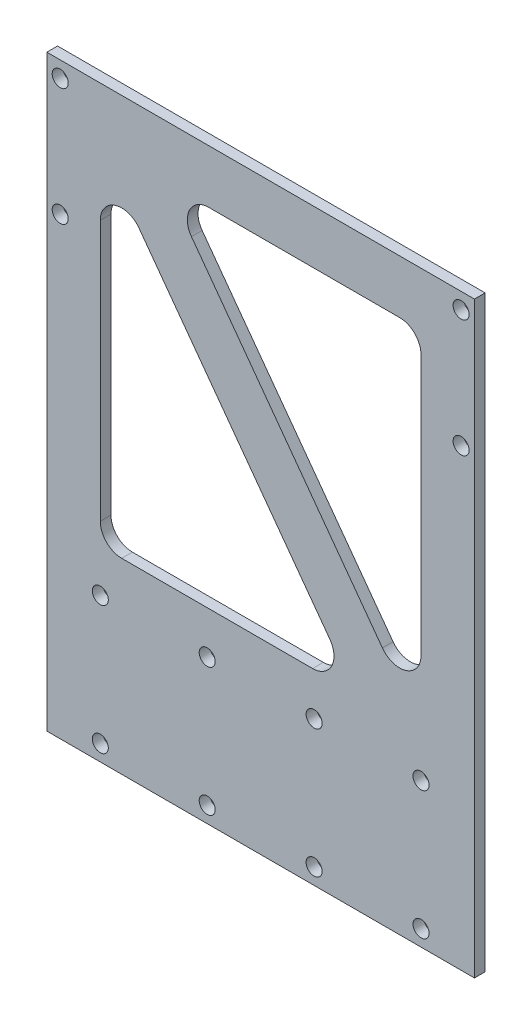
ISO-10303-21;
HEADER;
FILE_DESCRIPTION(('STEP AP214'),'2;1');
FILE_NAME('part.step','',(''),(''),'','','');
FILE_SCHEMA(('AUTOMOTIVE_DESIGN { 1 0 10303 214 1 1 1 1 }'));
ENDSEC;
DATA;
#1=APPLICATION_CONTEXT('core data for automotive mechanical design processes');
#2=APPLICATION_PROTOCOL_DEFINITION('international standard','automotive_design',2000,#1);
#3=PRODUCT_CONTEXT('',#1,'mechanical');
#4=PRODUCT('Part','Part','',(#3));
#5=PRODUCT_RELATED_PRODUCT_CATEGORY('part','',(#4));
#6=PRODUCT_DEFINITION_FORMATION('','',#4);
#7=PRODUCT_DEFINITION_CONTEXT('part definition',#1,'design');
#8=PRODUCT_DEFINITION('design','',#6,#7);
#9=PRODUCT_DEFINITION_SHAPE('','',#8);
#10=(LENGTH_UNIT() NAMED_UNIT(*) SI_UNIT(.MILLI.,.METRE.));
#11=(NAMED_UNIT(*) PLANE_ANGLE_UNIT() SI_UNIT($,.RADIAN.));
#12=(NAMED_UNIT(*) SI_UNIT($,.STERADIAN.) SOLID_ANGLE_UNIT());
#13=UNCERTAINTY_MEASURE_WITH_UNIT(LENGTH_MEASURE(1.E-05),#10,'distance_accuracy_value','');
#14=(GEOMETRIC_REPRESENTATION_CONTEXT(3) GLOBAL_UNCERTAINTY_ASSIGNED_CONTEXT((#13)) GLOBAL_UNIT_ASSIGNED_CONTEXT((#10,
#11,#12)) REPRESENTATION_CONTEXT('',''));
#15=CARTESIAN_POINT('',(0.,0.,0.));
#16=DIRECTION('',(0.,0.,1.));
#17=DIRECTION('',(1.,0.,0.));
#18=AXIS2_PLACEMENT_3D('',#15,#16,#17);
#19=CARTESIAN_POINT('',(0.,0.,2.));
#20=DIRECTION('',(0.,0.,-1.));
#21=DIRECTION('',(-1.,0.,0.));
#22=AXIS2_PLACEMENT_3D('',#19,#20,#21);
#23=PLANE('',#22);
#24=DIRECTION('',(0.590865015894451,-0.806770433885656,0.));
#25=VECTOR('',#24,1.);
#26=CARTESIAN_POINT('',(22.3950997458309,100.,2.));
#27=LINE('',#26,#25);
#28=CARTESIAN_POINT('',(27.0555902319542,93.6365399364222,2.));
#29=VERTEX_POINT('',#28);
#30=CARTESIAN_POINT('',(62.7729182644574,44.867898268921,2.));
#31=VERTEX_POINT('',#30);
#32=EDGE_CURVE('E540',#29,#31,#27,.T.);
#33=ORIENTED_EDGE('',*,*,#32,.F.);
#34=CARTESIAN_POINT('',(30.2826719674968,96.,2.));
#35=DIRECTION('',(0.,0.,-1.));
#36=DIRECTION('',(-1.,0.,0.));
#37=AXIS2_PLACEMENT_3D('',#34,#35,#36);
#38=CIRCLE('',#37,4.);
#39=CARTESIAN_POINT('',(30.2826719674968,100.,2.));
#40=VERTEX_POINT('',#39);
#41=EDGE_CURVE('E262',#29,#40,#38,.T.);
#42=ORIENTED_EDGE('',*,*,#41,.T.);
#43=DIRECTION('',(-1.,0.,0.));
#44=VECTOR('',#43,1.);
#45=CARTESIAN_POINT('',(70.,100.,2.));
#46=LINE('',#45,#44);
#47=CARTESIAN_POINT('',(66.,100.,2.));
#48=VERTEX_POINT('',#47);
#49=EDGE_CURVE('E296',#48,#40,#46,.T.);
#50=ORIENTED_EDGE('',*,*,#49,.F.);
#51=CARTESIAN_POINT('',(66.,96.,2.));
#52=DIRECTION('',(0.,0.,-1.));
#53=DIRECTION('',(-1.,0.,0.));
#54=AXIS2_PLACEMENT_3D('',#51,#52,#53);
#55=CIRCLE('',#54,4.);
#56=CARTESIAN_POINT('',(70.,96.,2.));
#57=VERTEX_POINT('',#56);
#58=EDGE_CURVE('E269',#48,#57,#55,.T.);
#59=ORIENTED_EDGE('',*,*,#58,.T.);
#60=DIRECTION('',(0.,1.,0.));
#61=VECTOR('',#60,1.);
#62=CARTESIAN_POINT('',(70.,35.,2.));
#63=LINE('',#62,#61);
#64=CARTESIAN_POINT('',(70.,47.2313583324988,2.));
#65=VERTEX_POINT('',#64);
#66=EDGE_CURVE('E551',#65,#57,#63,.T.);
#67=ORIENTED_EDGE('',*,*,#66,.F.);
#68=CARTESIAN_POINT('',(66.,47.2313583324988,2.));
#69=DIRECTION('',(0.,0.,-1.));
#70=DIRECTION('',(-1.,0.,0.));
#71=AXIS2_PLACEMENT_3D('',#68,#69,#70);
#72=CIRCLE('',#71,4.);
#73=EDGE_CURVE('E256',#65,#31,#72,.T.);
#74=ORIENTED_EDGE('',*,*,#73,.T.);
#75=EDGE_LOOP('',(#33,#42,#50,#59,#67,#74));
#76=FACE_BOUND('',#75,.T.);
#77=DIRECTION('',(0.,-1.,0.));
#78=VECTOR('',#77,1.);
#79=CARTESIAN_POINT('',(10.,100.,2.));
#80=LINE('',#79,#78);
#81=CARTESIAN_POINT('',(10.,87.7686416675012,2.));
#82=VERTEX_POINT('',#81);
#83=CARTESIAN_POINT('',(10.,39.,2.));
#84=VERTEX_POINT('',#83);
#85=EDGE_CURVE('E295',#82,#84,#80,.T.);
#86=ORIENTED_EDGE('',*,*,#85,.F.);
#87=CARTESIAN_POINT('',(14.,87.7686416675012,2.));
#88=DIRECTION('',(0.,0.,-1.));
#89=DIRECTION('',(-1.,0.,0.));
#90=AXIS2_PLACEMENT_3D('',#87,#88,#89);
#91=CIRCLE('',#90,4.);
#92=CARTESIAN_POINT('',(17.2270817355426,90.132101731079,2.));
#93=VERTEX_POINT('',#92);
#94=EDGE_CURVE('E53',#82,#93,#91,.T.);
#95=ORIENTED_EDGE('',*,*,#94,.T.);
#96=DIRECTION('',(-0.590865015894452,0.806770433885656,0.));
#97=VECTOR('',#96,1.);
#98=CARTESIAN_POINT('',(57.6049002541691,35.,2.));
#99=LINE('',#98,#97);
#100=CARTESIAN_POINT('',(52.9444097680458,41.3634600635778,2.));
#101=VERTEX_POINT('',#100);
#102=EDGE_CURVE('E292',#101,#93,#99,.T.);
#103=ORIENTED_EDGE('',*,*,#102,.F.);
#104=CARTESIAN_POINT('',(49.7173280325032,39.,2.));
#105=DIRECTION('',(0.,0.,-1.));
#106=DIRECTION('',(-1.,0.,0.));
#107=AXIS2_PLACEMENT_3D('',#104,#105,#106);
#108=CIRCLE('',#107,4.);
#109=CARTESIAN_POINT('',(49.7173280325032,35.,2.));
#110=VERTEX_POINT('',#109);
#111=EDGE_CURVE('E277',#101,#110,#108,.T.);
#112=ORIENTED_EDGE('',*,*,#111,.T.);
#113=DIRECTION('',(1.,0.,0.));
#114=VECTOR('',#113,1.);
#115=CARTESIAN_POINT('',(10.,35.,2.));
#116=LINE('',#115,#114);
#117=CARTESIAN_POINT('',(14.,35.,2.));
#118=VERTEX_POINT('',#117);
#119=EDGE_CURVE('E318',#118,#110,#116,.T.);
#120=ORIENTED_EDGE('',*,*,#119,.F.);
#121=CARTESIAN_POINT('',(14.,39.,2.));
#122=DIRECTION('',(0.,0.,-1.));
#123=DIRECTION('',(-1.,0.,0.));
#124=AXIS2_PLACEMENT_3D('',#121,#122,#123);
#125=CIRCLE('',#124,4.);
#126=EDGE_CURVE('E63',#118,#84,#125,.T.);
#127=ORIENTED_EDGE('',*,*,#126,.T.);
#128=EDGE_LOOP('',(#86,#95,#103,#112,#120,#127));
#129=FACE_BOUND('',#128,.T.);
#130=DIRECTION('',(0.,-1.,0.));
#131=VECTOR('',#130,1.);
#132=CARTESIAN_POINT('',(0.,0.,2.));
#133=LINE('',#132,#131);
#134=CARTESIAN_POINT('',(0.,110.,2.));
#135=VERTEX_POINT('',#134);
#136=CARTESIAN_POINT('',(0.,0.,2.));
#137=VERTEX_POINT('',#136);
#138=EDGE_CURVE('E173',#135,#137,#133,.T.);
#139=ORIENTED_EDGE('',*,*,#138,.T.);
#140=DIRECTION('',(1.,0.,0.));
#141=VECTOR('',#140,1.);
#142=CARTESIAN_POINT('',(0.,0.,2.));
#143=LINE('',#142,#141);
#144=CARTESIAN_POINT('',(80.,0.,2.));
#145=VERTEX_POINT('',#144);
#146=EDGE_CURVE('E157',#137,#145,#143,.T.);
#147=ORIENTED_EDGE('',*,*,#146,.T.);
#148=DIRECTION('',(0.,1.,0.));
#149=VECTOR('',#148,1.);
#150=CARTESIAN_POINT('',(80.,0.,2.));
#151=LINE('',#150,#149);
#152=CARTESIAN_POINT('',(80.,110.,2.));
#153=VERTEX_POINT('',#152);
#154=EDGE_CURVE('E168',#145,#153,#151,.T.);
#155=ORIENTED_EDGE('',*,*,#154,.T.);
#156=DIRECTION('',(-1.,0.,0.));
#157=VECTOR('',#156,1.);
#158=CARTESIAN_POINT('',(0.,110.,2.));
#159=LINE('',#158,#157);
#160=EDGE_CURVE('E176',#153,#135,#159,.T.);
#161=ORIENTED_EDGE('',*,*,#160,.T.);
#162=EDGE_LOOP('',(#139,#147,#155,#161));
#163=FACE_BOUND('',#162,.T.);
#164=CARTESIAN_POINT('',(9.99999999999999,3.,2.));
#165=DIRECTION('',(0.,0.,1.));
#166=DIRECTION('',(1.,0.,0.));
#167=AXIS2_PLACEMENT_3D('',#164,#165,#166);
#168=CIRCLE('',#167,1.5);
#169=CARTESIAN_POINT('',(11.5,3.,2.));
#170=VERTEX_POINT('',#169);
#171=EDGE_CURVE('E415',#170,#170,#168,.T.);
#172=ORIENTED_EDGE('',*,*,#171,.F.);
#173=EDGE_LOOP('',(#172));
#174=FACE_BOUND('',#173,.T.);
#175=CARTESIAN_POINT('',(30.,3.,2.));
#176=DIRECTION('',(0.,0.,1.));
#177=DIRECTION('',(1.,0.,0.));
#178=AXIS2_PLACEMENT_3D('',#175,#176,#177);
#179=CIRCLE('',#178,1.5);
#180=CARTESIAN_POINT('',(31.5,3.,2.));
#181=VERTEX_POINT('',#180);
#182=EDGE_CURVE('E410',#181,#181,#179,.T.);
#183=ORIENTED_EDGE('',*,*,#182,.F.);
#184=EDGE_LOOP('',(#183));
#185=FACE_BOUND('',#184,.T.);
#186=CARTESIAN_POINT('',(50.,3.,2.));
#187=DIRECTION('',(0.,0.,1.));
#188=DIRECTION('',(-1.,0.,0.));
#189=AXIS2_PLACEMENT_3D('',#186,#187,#188);
#190=CIRCLE('',#189,1.5);
#191=CARTESIAN_POINT('',(48.5,3.,2.));
#192=VERTEX_POINT('',#191);
#193=EDGE_CURVE('E398',#192,#192,#190,.T.);
#194=ORIENTED_EDGE('',*,*,#193,.F.);
#195=EDGE_LOOP('',(#194));
#196=FACE_BOUND('',#195,.T.);
#197=CARTESIAN_POINT('',(70.,3.,2.));
#198=DIRECTION('',(0.,0.,1.));
#199=DIRECTION('',(-1.,0.,0.));
#200=AXIS2_PLACEMENT_3D('',#197,#198,#199);
#201=CIRCLE('',#200,1.5);
#202=CARTESIAN_POINT('',(68.5,3.,2.));
#203=VERTEX_POINT('',#202);
#204=EDGE_CURVE('E393',#203,#203,#201,.T.);
#205=ORIENTED_EDGE('',*,*,#204,.F.);
#206=EDGE_LOOP('',(#205));
#207=FACE_BOUND('',#206,.T.);
#208=CARTESIAN_POINT('',(2.5,107.,2.));
#209=DIRECTION('',(0.,0.,1.));
#210=DIRECTION('',(1.,0.,0.));
#211=AXIS2_PLACEMENT_3D('',#208,#209,#210);
#212=CIRCLE('',#211,1.5);
#213=CARTESIAN_POINT('',(4.,107.,2.));
#214=VERTEX_POINT('',#213);
#215=EDGE_CURVE('E382',#214,#214,#212,.T.);
#216=ORIENTED_EDGE('',*,*,#215,.F.);
#217=EDGE_LOOP('',(#216));
#218=FACE_BOUND('',#217,.T.);
#219=CARTESIAN_POINT('',(2.5,85.,2.));
#220=DIRECTION('',(0.,0.,1.));
#221=DIRECTION('',(1.,0.,0.));
#222=AXIS2_PLACEMENT_3D('',#219,#220,#221);
#223=CIRCLE('',#222,1.5);
#224=CARTESIAN_POINT('',(4.,85.,2.));
#225=VERTEX_POINT('',#224);
#226=EDGE_CURVE('E376',#225,#225,#223,.T.);
#227=ORIENTED_EDGE('',*,*,#226,.F.);
#228=EDGE_LOOP('',(#227));
#229=FACE_BOUND('',#228,.T.);
#230=CARTESIAN_POINT('',(77.5,85.,2.));
#231=DIRECTION('',(0.,0.,1.));
#232=DIRECTION('',(-1.,0.,0.));
#233=AXIS2_PLACEMENT_3D('',#230,#231,#232);
#234=CIRCLE('',#233,1.5);
#235=CARTESIAN_POINT('',(76.,85.,2.));
#236=VERTEX_POINT('',#235);
#237=EDGE_CURVE('E366',#236,#236,#234,.T.);
#238=ORIENTED_EDGE('',*,*,#237,.F.);
#239=EDGE_LOOP('',(#238));
#240=FACE_BOUND('',#239,.T.);
#241=CARTESIAN_POINT('',(77.5,107.,2.));
#242=DIRECTION('',(0.,0.,1.));
#243=DIRECTION('',(-1.,0.,0.));
#244=AXIS2_PLACEMENT_3D('',#241,#242,#243);
#245=CIRCLE('',#244,1.5);
#246=CARTESIAN_POINT('',(76.,107.,2.));
#247=VERTEX_POINT('',#246);
#248=EDGE_CURVE('E360',#247,#247,#245,.T.);
#249=ORIENTED_EDGE('',*,*,#248,.F.);
#250=EDGE_LOOP('',(#249));
#251=FACE_BOUND('',#250,.T.);
#252=CARTESIAN_POINT('',(9.99999999999991,27.,2.));
#253=DIRECTION('',(0.,0.,1.));
#254=DIRECTION('',(1.,0.,0.));
#255=AXIS2_PLACEMENT_3D('',#252,#253,#254);
#256=CIRCLE('',#255,1.5);
#257=CARTESIAN_POINT('',(11.4999999999999,27.,2.));
#258=VERTEX_POINT('',#257);
#259=EDGE_CURVE('E355',#258,#258,#256,.T.);
#260=ORIENTED_EDGE('',*,*,#259,.F.);
#261=EDGE_LOOP('',(#260));
#262=FACE_BOUND('',#261,.T.);
#263=CARTESIAN_POINT('',(29.9999999999999,27.,2.));
#264=DIRECTION('',(0.,0.,1.));
#265=DIRECTION('',(1.,0.,0.));
#266=AXIS2_PLACEMENT_3D('',#263,#264,#265);
#267=CIRCLE('',#266,1.5);
#268=CARTESIAN_POINT('',(31.4999999999999,27.,2.));
#269=VERTEX_POINT('',#268);
#270=EDGE_CURVE('E343',#269,#269,#267,.T.);
#271=ORIENTED_EDGE('',*,*,#270,.F.);
#272=EDGE_LOOP('',(#271));
#273=FACE_BOUND('',#272,.T.);
#274=CARTESIAN_POINT('',(49.9999999999999,27.,2.));
#275=DIRECTION('',(0.,0.,1.));
#276=DIRECTION('',(-1.,0.,0.));
#277=AXIS2_PLACEMENT_3D('',#274,#275,#276);
#278=CIRCLE('',#277,1.5);
#279=CARTESIAN_POINT('',(48.4999999999999,27.,2.));
#280=VERTEX_POINT('',#279);
#281=EDGE_CURVE('E338',#280,#280,#278,.T.);
#282=ORIENTED_EDGE('',*,*,#281,.F.);
#283=EDGE_LOOP('',(#282));
#284=FACE_BOUND('',#283,.T.);
#285=CARTESIAN_POINT('',(69.9999999999999,27.,2.));
#286=DIRECTION('',(0.,0.,1.));
#287=DIRECTION('',(-1.,0.,0.));
#288=AXIS2_PLACEMENT_3D('',#285,#286,#287);
#289=CIRCLE('',#288,1.5);
#290=CARTESIAN_POINT('',(68.4999999999999,27.,2.));
#291=VERTEX_POINT('',#290);
#292=EDGE_CURVE('E327',#291,#291,#289,.T.);
#293=ORIENTED_EDGE('',*,*,#292,.F.);
#294=EDGE_LOOP('',(#293));
#295=FACE_BOUND('',#294,.T.);
#296=ADVANCED_FACE('F44',(#76,#129,#163,#174,#185,#196,#207,#218,#229,#240,#251,#262,#273,#284,
#295),#23,.F.);
#297=CARTESIAN_POINT('',(0.,0.,0.));
#298=DIRECTION('',(0.,0.,-1.));
#299=DIRECTION('',(-1.,0.,0.));
#300=AXIS2_PLACEMENT_3D('',#297,#298,#299);
#301=PLANE('',#300);
#302=DIRECTION('',(1.,0.,0.));
#303=VECTOR('',#302,1.);
#304=CARTESIAN_POINT('',(0.,100.,0.));
#305=LINE('',#304,#303);
#306=CARTESIAN_POINT('',(30.2826719674968,100.,0.));
#307=VERTEX_POINT('',#306);
#308=CARTESIAN_POINT('',(66.,100.,0.));
#309=VERTEX_POINT('',#308);
#310=EDGE_CURVE('E212',#307,#309,#305,.T.);
#311=ORIENTED_EDGE('',*,*,#310,.F.);
#312=CARTESIAN_POINT('',(30.2826719674968,96.,0.));
#313=DIRECTION('',(0.,0.,-1.));
#314=DIRECTION('',(-1.,0.,0.));
#315=AXIS2_PLACEMENT_3D('',#312,#313,#314);
#316=CIRCLE('',#315,4.);
#317=CARTESIAN_POINT('',(27.0555902319542,93.6365399364222,0.));
#318=VERTEX_POINT('',#317);
#319=EDGE_CURVE('E270',#307,#318,#316,.F.);
#320=ORIENTED_EDGE('',*,*,#319,.T.);
#321=DIRECTION('',(-0.590865015894452,0.806770433885656,0.));
#322=VECTOR('',#321,1.);
#323=CARTESIAN_POINT('',(62.2457321928792,45.5877211121498,0.));
#324=LINE('',#323,#322);
#325=CARTESIAN_POINT('',(62.7729182644574,44.867898268921,0.));
#326=VERTEX_POINT('',#325);
#327=EDGE_CURVE('E206',#326,#318,#324,.T.);
#328=ORIENTED_EDGE('',*,*,#327,.F.);
#329=CARTESIAN_POINT('',(66.,47.2313583324988,0.));
#330=DIRECTION('',(0.,0.,-1.));
#331=DIRECTION('',(-1.,0.,0.));
#332=AXIS2_PLACEMENT_3D('',#329,#330,#331);
#333=CIRCLE('',#332,4.);
#334=CARTESIAN_POINT('',(70.,47.2313583324988,0.));
#335=VERTEX_POINT('',#334);
#336=EDGE_CURVE('E261',#326,#335,#333,.F.);
#337=ORIENTED_EDGE('',*,*,#336,.T.);
#338=DIRECTION('',(0.,-1.,0.));
#339=VECTOR('',#338,1.);
#340=CARTESIAN_POINT('',(70.,0.,0.));
#341=LINE('',#340,#339);
#342=CARTESIAN_POINT('',(70.,96.,0.));
#343=VERTEX_POINT('',#342);
#344=EDGE_CURVE('E209',#343,#335,#341,.T.);
#345=ORIENTED_EDGE('',*,*,#344,.F.);
#346=CARTESIAN_POINT('',(66.,96.,0.));
#347=DIRECTION('',(0.,0.,-1.));
#348=DIRECTION('',(-1.,0.,0.));
#349=AXIS2_PLACEMENT_3D('',#346,#347,#348);
#350=CIRCLE('',#349,4.);
#351=EDGE_CURVE('E272',#343,#309,#350,.F.);
#352=ORIENTED_EDGE('',*,*,#351,.T.);
#353=EDGE_LOOP('',(#311,#320,#328,#337,#345,#352));
#354=FACE_BOUND('',#353,.T.);
#355=DIRECTION('',(0.590865015894452,-0.806770433885656,0.));
#356=VECTOR('',#355,1.);
#357=CARTESIAN_POINT('',(54.1780278540227,39.6790709532052,0.));
#358=LINE('',#357,#356);
#359=CARTESIAN_POINT('',(17.2270817355426,90.132101731079,0.));
#360=VERTEX_POINT('',#359);
#361=CARTESIAN_POINT('',(52.9444097680458,41.3634600635778,0.));
#362=VERTEX_POINT('',#361);
#363=EDGE_CURVE('E205',#360,#362,#358,.T.);
#364=ORIENTED_EDGE('',*,*,#363,.F.);
#365=CARTESIAN_POINT('',(14.,87.7686416675012,0.));
#366=DIRECTION('',(0.,0.,-1.));
#367=DIRECTION('',(-1.,0.,0.));
#368=AXIS2_PLACEMENT_3D('',#365,#366,#367);
#369=CIRCLE('',#368,4.);
#370=CARTESIAN_POINT('',(10.,87.7686416675012,0.));
#371=VERTEX_POINT('',#370);
#372=EDGE_CURVE('E11',#360,#371,#369,.F.);
#373=ORIENTED_EDGE('',*,*,#372,.T.);
#374=DIRECTION('',(0.,1.,0.));
#375=VECTOR('',#374,1.);
#376=CARTESIAN_POINT('',(10.,0.,0.));
#377=LINE('',#376,#375);
#378=CARTESIAN_POINT('',(10.,39.,0.));
#379=VERTEX_POINT('',#378);
#380=EDGE_CURVE('E190',#379,#371,#377,.T.);
#381=ORIENTED_EDGE('',*,*,#380,.F.);
#382=CARTESIAN_POINT('',(14.,39.,0.));
#383=DIRECTION('',(0.,0.,-1.));
#384=DIRECTION('',(-1.,0.,0.));
#385=AXIS2_PLACEMENT_3D('',#382,#383,#384);
#386=CIRCLE('',#385,4.);
#387=CARTESIAN_POINT('',(14.,35.,0.));
#388=VERTEX_POINT('',#387);
#389=EDGE_CURVE('E284',#379,#388,#386,.F.);
#390=ORIENTED_EDGE('',*,*,#389,.T.);
#391=DIRECTION('',(-1.,0.,0.));
#392=VECTOR('',#391,1.);
#393=CARTESIAN_POINT('',(0.,35.,0.));
#394=LINE('',#393,#392);
#395=CARTESIAN_POINT('',(49.7173280325032,35.,0.));
#396=VERTEX_POINT('',#395);
#397=EDGE_CURVE('E194',#396,#388,#394,.T.);
#398=ORIENTED_EDGE('',*,*,#397,.F.);
#399=CARTESIAN_POINT('',(49.7173280325032,39.,0.));
#400=DIRECTION('',(0.,0.,-1.));
#401=DIRECTION('',(-1.,0.,0.));
#402=AXIS2_PLACEMENT_3D('',#399,#400,#401);
#403=CIRCLE('',#402,4.);
#404=EDGE_CURVE('E276',#396,#362,#403,.F.);
#405=ORIENTED_EDGE('',*,*,#404,.T.);
#406=EDGE_LOOP('',(#364,#373,#381,#390,#398,#405));
#407=FACE_BOUND('',#406,.T.);
#408=CARTESIAN_POINT('',(49.9999999999999,27.,0.));
#409=DIRECTION('',(0.,0.,1.));
#410=DIRECTION('',(-1.,0.,0.));
#411=AXIS2_PLACEMENT_3D('',#408,#409,#410);
#412=CIRCLE('',#411,1.5);
#413=CARTESIAN_POINT('',(48.4999999999999,27.,0.));
#414=VERTEX_POINT('',#413);
#415=EDGE_CURVE('E331',#414,#414,#412,.T.);
#416=ORIENTED_EDGE('',*,*,#415,.T.);
#417=EDGE_LOOP('',(#416));
#418=FACE_BOUND('',#417,.T.);
#419=CARTESIAN_POINT('',(9.99999999999991,27.,0.));
#420=DIRECTION('',(0.,0.,1.));
#421=DIRECTION('',(1.,0.,0.));
#422=AXIS2_PLACEMENT_3D('',#419,#420,#421);
#423=CIRCLE('',#422,1.5);
#424=CARTESIAN_POINT('',(11.4999999999999,27.,0.));
#425=VERTEX_POINT('',#424);
#426=EDGE_CURVE('E346',#425,#425,#423,.T.);
#427=ORIENTED_EDGE('',*,*,#426,.T.);
#428=EDGE_LOOP('',(#427));
#429=FACE_BOUND('',#428,.T.);
#430=CARTESIAN_POINT('',(77.5,85.,0.));
#431=DIRECTION('',(0.,0.,1.));
#432=DIRECTION('',(-1.,0.,0.));
#433=AXIS2_PLACEMENT_3D('',#430,#431,#432);
#434=CIRCLE('',#433,1.5);
#435=CARTESIAN_POINT('',(76.,85.,0.));
#436=VERTEX_POINT('',#435);
#437=EDGE_CURVE('E365',#436,#436,#434,.T.);
#438=ORIENTED_EDGE('',*,*,#437,.T.);
#439=EDGE_LOOP('',(#438));
#440=FACE_BOUND('',#439,.T.);
#441=CARTESIAN_POINT('',(2.5,107.,0.));
#442=DIRECTION('',(0.,0.,1.));
#443=DIRECTION('',(1.,0.,0.));
#444=AXIS2_PLACEMENT_3D('',#441,#442,#443);
#445=CIRCLE('',#444,1.5);
#446=CARTESIAN_POINT('',(4.,107.,0.));
#447=VERTEX_POINT('',#446);
#448=EDGE_CURVE('E377',#447,#447,#445,.T.);
#449=ORIENTED_EDGE('',*,*,#448,.T.);
#450=EDGE_LOOP('',(#449));
#451=FACE_BOUND('',#450,.T.);
#452=CARTESIAN_POINT('',(50.,3.,0.));
#453=DIRECTION('',(0.,0.,1.));
#454=DIRECTION('',(-1.,0.,0.));
#455=AXIS2_PLACEMENT_3D('',#452,#453,#454);
#456=CIRCLE('',#455,1.5);
#457=CARTESIAN_POINT('',(48.5,3.,0.));
#458=VERTEX_POINT('',#457);
#459=EDGE_CURVE('E392',#458,#458,#456,.T.);
#460=ORIENTED_EDGE('',*,*,#459,.T.);
#461=EDGE_LOOP('',(#460));
#462=FACE_BOUND('',#461,.T.);
#463=CARTESIAN_POINT('',(9.99999999999999,3.,0.));
#464=DIRECTION('',(0.,0.,1.));
#465=DIRECTION('',(1.,0.,0.));
#466=AXIS2_PLACEMENT_3D('',#463,#464,#465);
#467=CIRCLE('',#466,1.5);
#468=CARTESIAN_POINT('',(11.5,3.,0.));
#469=VERTEX_POINT('',#468);
#470=EDGE_CURVE('E411',#469,#469,#467,.T.);
#471=ORIENTED_EDGE('',*,*,#470,.T.);
#472=EDGE_LOOP('',(#471));
#473=FACE_BOUND('',#472,.T.);
#474=DIRECTION('',(0.,-1.,0.));
#475=VECTOR('',#474,1.);
#476=CARTESIAN_POINT('',(0.,0.,0.));
#477=LINE('',#476,#475);
#478=CARTESIAN_POINT('',(0.,110.,0.));
#479=VERTEX_POINT('',#478);
#480=CARTESIAN_POINT('',(0.,0.,0.));
#481=VERTEX_POINT('',#480);
#482=EDGE_CURVE('E183',#479,#481,#477,.T.);
#483=ORIENTED_EDGE('',*,*,#482,.F.);
#484=DIRECTION('',(-1.,0.,0.));
#485=VECTOR('',#484,1.);
#486=CARTESIAN_POINT('',(0.,110.,0.));
#487=LINE('',#486,#485);
#488=CARTESIAN_POINT('',(80.,110.,0.));
#489=VERTEX_POINT('',#488);
#490=EDGE_CURVE('E182',#489,#479,#487,.T.);
#491=ORIENTED_EDGE('',*,*,#490,.F.);
#492=DIRECTION('',(0.,1.,0.));
#493=VECTOR('',#492,1.);
#494=CARTESIAN_POINT('',(80.,0.,0.));
#495=LINE('',#494,#493);
#496=CARTESIAN_POINT('',(80.,0.,0.));
#497=VERTEX_POINT('',#496);
#498=EDGE_CURVE('E431',#497,#489,#495,.T.);
#499=ORIENTED_EDGE('',*,*,#498,.F.);
#500=DIRECTION('',(1.,0.,0.));
#501=VECTOR('',#500,1.);
#502=CARTESIAN_POINT('',(0.,0.,0.));
#503=LINE('',#502,#501);
#504=EDGE_CURVE('E428',#481,#497,#503,.T.);
#505=ORIENTED_EDGE('',*,*,#504,.F.);
#506=EDGE_LOOP('',(#483,#491,#499,#505));
#507=FACE_BOUND('',#506,.T.);
#508=CARTESIAN_POINT('',(30.,3.,0.));
#509=DIRECTION('',(0.,0.,1.));
#510=DIRECTION('',(1.,0.,0.));
#511=AXIS2_PLACEMENT_3D('',#508,#509,#510);
#512=CIRCLE('',#511,1.5);
#513=CARTESIAN_POINT('',(31.5,3.,0.));
#514=VERTEX_POINT('',#513);
#515=EDGE_CURVE('E401',#514,#514,#512,.T.);
#516=ORIENTED_EDGE('',*,*,#515,.T.);
#517=EDGE_LOOP('',(#516));
#518=FACE_BOUND('',#517,.T.);
#519=CARTESIAN_POINT('',(70.,3.,0.));
#520=DIRECTION('',(0.,0.,1.));
#521=DIRECTION('',(-1.,0.,0.));
#522=AXIS2_PLACEMENT_3D('',#519,#520,#521);
#523=CIRCLE('',#522,1.5);
#524=CARTESIAN_POINT('',(68.5,3.,0.));
#525=VERTEX_POINT('',#524);
#526=EDGE_CURVE('E390',#525,#525,#523,.T.);
#527=ORIENTED_EDGE('',*,*,#526,.T.);
#528=EDGE_LOOP('',(#527));
#529=FACE_BOUND('',#528,.T.);
#530=CARTESIAN_POINT('',(2.5,85.,0.));
#531=DIRECTION('',(0.,0.,1.));
#532=DIRECTION('',(1.,0.,0.));
#533=AXIS2_PLACEMENT_3D('',#530,#531,#532);
#534=CIRCLE('',#533,1.5);
#535=CARTESIAN_POINT('',(4.,85.,0.));
#536=VERTEX_POINT('',#535);
#537=EDGE_CURVE('E375',#536,#536,#534,.T.);
#538=ORIENTED_EDGE('',*,*,#537,.T.);
#539=EDGE_LOOP('',(#538));
#540=FACE_BOUND('',#539,.T.);
#541=CARTESIAN_POINT('',(77.5,107.,0.));
#542=DIRECTION('',(0.,0.,1.));
#543=DIRECTION('',(-1.,0.,0.));
#544=AXIS2_PLACEMENT_3D('',#541,#542,#543);
#545=CIRCLE('',#544,1.5);
#546=CARTESIAN_POINT('',(76.,107.,0.));
#547=VERTEX_POINT('',#546);
#548=EDGE_CURVE('E356',#547,#547,#545,.T.);
#549=ORIENTED_EDGE('',*,*,#548,.T.);
#550=EDGE_LOOP('',(#549));
#551=FACE_BOUND('',#550,.T.);
#552=CARTESIAN_POINT('',(29.9999999999999,27.,0.));
#553=DIRECTION('',(0.,0.,1.));
#554=DIRECTION('',(1.,0.,0.));
#555=AXIS2_PLACEMENT_3D('',#552,#553,#554);
#556=CIRCLE('',#555,1.5);
#557=CARTESIAN_POINT('',(31.4999999999999,27.,0.));
#558=VERTEX_POINT('',#557);
#559=EDGE_CURVE('E337',#558,#558,#556,.T.);
#560=ORIENTED_EDGE('',*,*,#559,.T.);
#561=EDGE_LOOP('',(#560));
#562=FACE_BOUND('',#561,.T.);
#563=CARTESIAN_POINT('',(69.9999999999999,27.,0.));
#564=DIRECTION('',(0.,0.,1.));
#565=DIRECTION('',(-1.,0.,0.));
#566=AXIS2_PLACEMENT_3D('',#563,#564,#565);
#567=CIRCLE('',#566,1.5);
#568=CARTESIAN_POINT('',(68.4999999999999,27.,0.));
#569=VERTEX_POINT('',#568);
#570=EDGE_CURVE('E325',#569,#569,#567,.T.);
#571=ORIENTED_EDGE('',*,*,#570,.T.);
#572=EDGE_LOOP('',(#571));
#573=FACE_BOUND('',#572,.T.);
#574=ADVANCED_FACE('F304',(#354,#407,#418,#429,#440,#451,#462,#473,#507,#518,#529,#540,#551,
#562,#573),#301,.T.);
#575=CARTESIAN_POINT('',(0.,0.,2.));
#576=DIRECTION('',(1.,0.,0.));
#577=DIRECTION('',(0.,0.,-1.));
#578=AXIS2_PLACEMENT_3D('',#575,#576,#577);
#579=PLANE('',#578);
#580=ORIENTED_EDGE('',*,*,#482,.T.);
#581=DIRECTION('',(0.,0.,-1.));
#582=VECTOR('',#581,1.);
#583=CARTESIAN_POINT('',(0.,0.,2.));
#584=LINE('',#583,#582);
#585=EDGE_CURVE('E162',#137,#481,#584,.T.);
#586=ORIENTED_EDGE('',*,*,#585,.F.);
#587=ORIENTED_EDGE('',*,*,#138,.F.);
#588=DIRECTION('',(0.,0.,-1.));
#589=VECTOR('',#588,1.);
#590=CARTESIAN_POINT('',(0.,110.,2.));
#591=LINE('',#590,#589);
#592=EDGE_CURVE('E422',#135,#479,#591,.T.);
#593=ORIENTED_EDGE('',*,*,#592,.T.);
#594=EDGE_LOOP('',(#580,#586,#587,#593));
#595=FACE_BOUND('',#594,.T.);
#596=ADVANCED_FACE('F181',(#595),#579,.F.);
#597=CARTESIAN_POINT('',(0.,0.,2.));
#598=DIRECTION('',(0.,1.,0.));
#599=DIRECTION('',(0.,0.,1.));
#600=AXIS2_PLACEMENT_3D('',#597,#598,#599);
#601=PLANE('',#600);
#602=ORIENTED_EDGE('',*,*,#504,.T.);
#603=DIRECTION('',(0.,0.,-1.));
#604=VECTOR('',#603,1.);
#605=CARTESIAN_POINT('',(80.,0.,2.));
#606=LINE('',#605,#604);
#607=EDGE_CURVE('E167',#145,#497,#606,.T.);
#608=ORIENTED_EDGE('',*,*,#607,.F.);
#609=ORIENTED_EDGE('',*,*,#146,.F.);
#610=ORIENTED_EDGE('',*,*,#585,.T.);
#611=EDGE_LOOP('',(#602,#608,#609,#610));
#612=FACE_BOUND('',#611,.T.);
#613=ADVANCED_FACE('F161',(#612),#601,.F.);
#614=CARTESIAN_POINT('',(80.,0.,2.));
#615=DIRECTION('',(-1.,0.,0.));
#616=DIRECTION('',(0.,0.,1.));
#617=AXIS2_PLACEMENT_3D('',#614,#615,#616);
#618=PLANE('',#617);
#619=ORIENTED_EDGE('',*,*,#498,.T.);
#620=DIRECTION('',(0.,0.,-1.));
#621=VECTOR('',#620,1.);
#622=CARTESIAN_POINT('',(80.,110.,2.));
#623=LINE('',#622,#621);
#624=EDGE_CURVE('E198',#153,#489,#623,.T.);
#625=ORIENTED_EDGE('',*,*,#624,.F.);
#626=ORIENTED_EDGE('',*,*,#154,.F.);
#627=ORIENTED_EDGE('',*,*,#607,.T.);
#628=EDGE_LOOP('',(#619,#625,#626,#627));
#629=FACE_BOUND('',#628,.T.);
#630=ADVANCED_FACE('F450',(#629),#618,.F.);
#631=CARTESIAN_POINT('',(0.,110.,2.));
#632=DIRECTION('',(0.,-1.,0.));
#633=DIRECTION('',(0.,0.,-1.));
#634=AXIS2_PLACEMENT_3D('',#631,#632,#633);
#635=PLANE('',#634);
#636=ORIENTED_EDGE('',*,*,#490,.T.);
#637=ORIENTED_EDGE('',*,*,#592,.F.);
#638=ORIENTED_EDGE('',*,*,#160,.F.);
#639=ORIENTED_EDGE('',*,*,#624,.T.);
#640=EDGE_LOOP('',(#636,#637,#638,#639));
#641=FACE_BOUND('',#640,.T.);
#642=ADVANCED_FACE('F445',(#641),#635,.F.);
#643=CARTESIAN_POINT('',(9.99999999999999,3.,2.));
#644=DIRECTION('',(0.,0.,-1.));
#645=DIRECTION('',(-1.,0.,0.));
#646=AXIS2_PLACEMENT_3D('',#643,#644,#645);
#647=CYLINDRICAL_SURFACE('',#646,1.5);
#648=ORIENTED_EDGE('',*,*,#171,.T.);
#649=EDGE_LOOP('',(#648));
#650=FACE_BOUND('',#649,.T.);
#651=ORIENTED_EDGE('',*,*,#470,.F.);
#652=EDGE_LOOP('',(#651));
#653=FACE_BOUND('',#652,.T.);
#654=ADVANCED_FACE('F454',(#650,#653),#647,.F.);
#655=CARTESIAN_POINT('',(30.,3.,2.));
#656=DIRECTION('',(0.,0.,-1.));
#657=DIRECTION('',(-1.,0.,0.));
#658=AXIS2_PLACEMENT_3D('',#655,#656,#657);
#659=CYLINDRICAL_SURFACE('',#658,1.5);
#660=ORIENTED_EDGE('',*,*,#182,.T.);
#661=EDGE_LOOP('',(#660));
#662=FACE_BOUND('',#661,.T.);
#663=ORIENTED_EDGE('',*,*,#515,.F.);
#664=EDGE_LOOP('',(#663));
#665=FACE_BOUND('',#664,.T.);
#666=ADVANCED_FACE('F467',(#662,#665),#659,.F.);
#667=CARTESIAN_POINT('',(50.,3.,2.));
#668=DIRECTION('',(0.,0.,-1.));
#669=DIRECTION('',(-1.,0.,0.));
#670=AXIS2_PLACEMENT_3D('',#667,#668,#669);
#671=CYLINDRICAL_SURFACE('',#670,1.5);
#672=ORIENTED_EDGE('',*,*,#193,.T.);
#673=EDGE_LOOP('',(#672));
#674=FACE_BOUND('',#673,.T.);
#675=ORIENTED_EDGE('',*,*,#459,.F.);
#676=EDGE_LOOP('',(#675));
#677=FACE_BOUND('',#676,.T.);
#678=ADVANCED_FACE('F473',(#674,#677),#671,.F.);
#679=CARTESIAN_POINT('',(70.,3.,2.));
#680=DIRECTION('',(0.,0.,-1.));
#681=DIRECTION('',(-1.,0.,0.));
#682=AXIS2_PLACEMENT_3D('',#679,#680,#681);
#683=CYLINDRICAL_SURFACE('',#682,1.5);
#684=ORIENTED_EDGE('',*,*,#204,.T.);
#685=EDGE_LOOP('',(#684));
#686=FACE_BOUND('',#685,.T.);
#687=ORIENTED_EDGE('',*,*,#526,.F.);
#688=EDGE_LOOP('',(#687));
#689=FACE_BOUND('',#688,.T.);
#690=ADVANCED_FACE('F474',(#686,#689),#683,.F.);
#691=CARTESIAN_POINT('',(2.5,107.,2.));
#692=DIRECTION('',(0.,0.,-1.));
#693=DIRECTION('',(-1.,0.,0.));
#694=AXIS2_PLACEMENT_3D('',#691,#692,#693);
#695=CYLINDRICAL_SURFACE('',#694,1.5);
#696=ORIENTED_EDGE('',*,*,#215,.T.);
#697=EDGE_LOOP('',(#696));
#698=FACE_BOUND('',#697,.T.);
#699=ORIENTED_EDGE('',*,*,#448,.F.);
#700=EDGE_LOOP('',(#699));
#701=FACE_BOUND('',#700,.T.);
#702=ADVANCED_FACE('F479',(#698,#701),#695,.F.);
#703=CARTESIAN_POINT('',(2.5,85.,2.));
#704=DIRECTION('',(0.,0.,-1.));
#705=DIRECTION('',(-1.,0.,0.));
#706=AXIS2_PLACEMENT_3D('',#703,#704,#705);
#707=CYLINDRICAL_SURFACE('',#706,1.5);
#708=ORIENTED_EDGE('',*,*,#226,.T.);
#709=EDGE_LOOP('',(#708));
#710=FACE_BOUND('',#709,.T.);
#711=ORIENTED_EDGE('',*,*,#537,.F.);
#712=EDGE_LOOP('',(#711));
#713=FACE_BOUND('',#712,.T.);
#714=ADVANCED_FACE('F483',(#710,#713),#707,.F.);
#715=CARTESIAN_POINT('',(77.5,85.,2.));
#716=DIRECTION('',(0.,0.,-1.));
#717=DIRECTION('',(-1.,0.,0.));
#718=AXIS2_PLACEMENT_3D('',#715,#716,#717);
#719=CYLINDRICAL_SURFACE('',#718,1.5);
#720=ORIENTED_EDGE('',*,*,#237,.T.);
#721=EDGE_LOOP('',(#720));
#722=FACE_BOUND('',#721,.T.);
#723=ORIENTED_EDGE('',*,*,#437,.F.);
#724=EDGE_LOOP('',(#723));
#725=FACE_BOUND('',#724,.T.);
#726=ADVANCED_FACE('F490',(#722,#725),#719,.F.);
#727=CARTESIAN_POINT('',(77.5,107.,2.));
#728=DIRECTION('',(0.,0.,-1.));
#729=DIRECTION('',(-1.,0.,0.));
#730=AXIS2_PLACEMENT_3D('',#727,#728,#729);
#731=CYLINDRICAL_SURFACE('',#730,1.5);
#732=ORIENTED_EDGE('',*,*,#248,.T.);
#733=EDGE_LOOP('',(#732));
#734=FACE_BOUND('',#733,.T.);
#735=ORIENTED_EDGE('',*,*,#548,.F.);
#736=EDGE_LOOP('',(#735));
#737=FACE_BOUND('',#736,.T.);
#738=ADVANCED_FACE('F491',(#734,#737),#731,.F.);
#739=CARTESIAN_POINT('',(9.99999999999991,27.,2.));
#740=DIRECTION('',(0.,0.,-1.));
#741=DIRECTION('',(-1.,0.,0.));
#742=AXIS2_PLACEMENT_3D('',#739,#740,#741);
#743=CYLINDRICAL_SURFACE('',#742,1.5);
#744=ORIENTED_EDGE('',*,*,#259,.T.);
#745=EDGE_LOOP('',(#744));
#746=FACE_BOUND('',#745,.T.);
#747=ORIENTED_EDGE('',*,*,#426,.F.);
#748=EDGE_LOOP('',(#747));
#749=FACE_BOUND('',#748,.T.);
#750=ADVANCED_FACE('F494',(#746,#749),#743,.F.);
#751=CARTESIAN_POINT('',(29.9999999999999,27.,2.));
#752=DIRECTION('',(0.,0.,-1.));
#753=DIRECTION('',(-1.,0.,0.));
#754=AXIS2_PLACEMENT_3D('',#751,#752,#753);
#755=CYLINDRICAL_SURFACE('',#754,1.5);
#756=ORIENTED_EDGE('',*,*,#270,.T.);
#757=EDGE_LOOP('',(#756));
#758=FACE_BOUND('',#757,.T.);
#759=ORIENTED_EDGE('',*,*,#559,.F.);
#760=EDGE_LOOP('',(#759));
#761=FACE_BOUND('',#760,.T.);
#762=ADVANCED_FACE('F496',(#758,#761),#755,.F.);
#763=CARTESIAN_POINT('',(49.9999999999999,27.,2.));
#764=DIRECTION('',(0.,0.,-1.));
#765=DIRECTION('',(-1.,0.,0.));
#766=AXIS2_PLACEMENT_3D('',#763,#764,#765);
#767=CYLINDRICAL_SURFACE('',#766,1.5);
#768=ORIENTED_EDGE('',*,*,#281,.T.);
#769=EDGE_LOOP('',(#768));
#770=FACE_BOUND('',#769,.T.);
#771=ORIENTED_EDGE('',*,*,#415,.F.);
#772=EDGE_LOOP('',(#771));
#773=FACE_BOUND('',#772,.T.);
#774=ADVANCED_FACE('F501',(#770,#773),#767,.F.);
#775=CARTESIAN_POINT('',(69.9999999999999,27.,2.));
#776=DIRECTION('',(0.,0.,-1.));
#777=DIRECTION('',(-1.,0.,0.));
#778=AXIS2_PLACEMENT_3D('',#775,#776,#777);
#779=CYLINDRICAL_SURFACE('',#778,1.5);
#780=ORIENTED_EDGE('',*,*,#292,.T.);
#781=EDGE_LOOP('',(#780));
#782=FACE_BOUND('',#781,.T.);
#783=ORIENTED_EDGE('',*,*,#570,.F.);
#784=EDGE_LOOP('',(#783));
#785=FACE_BOUND('',#784,.T.);
#786=ADVANCED_FACE('F507',(#782,#785),#779,.F.);
#787=CARTESIAN_POINT('',(57.6049002541691,35.,-8.));
#788=DIRECTION('',(0.806770433885656,0.590865015894451,0.));
#789=DIRECTION('',(-0.590865015894452,0.806770433885656,0.));
#790=AXIS2_PLACEMENT_3D('',#787,#788,#789);
#791=PLANE('',#790);
#792=ORIENTED_EDGE('',*,*,#363,.T.);
#793=DIRECTION('',(0.,0.,1.));
#794=VECTOR('',#793,1.);
#795=CARTESIAN_POINT('',(52.9444097680458,41.3634600635778,2.));
#796=LINE('',#795,#794);
#797=EDGE_CURVE('E243',#362,#101,#796,.T.);
#798=ORIENTED_EDGE('',*,*,#797,.T.);
#799=ORIENTED_EDGE('',*,*,#102,.T.);
#800=DIRECTION('',(0.,0.,1.));
#801=VECTOR('',#800,1.);
#802=CARTESIAN_POINT('',(17.2270817355426,90.132101731079,0.));
#803=LINE('',#802,#801);
#804=EDGE_CURVE('E236',#93,#360,#803,.F.);
#805=ORIENTED_EDGE('',*,*,#804,.T.);
#806=EDGE_LOOP('',(#792,#798,#799,#805));
#807=FACE_BOUND('',#806,.T.);
#808=ADVANCED_FACE('F294',(#807),#791,.F.);
#809=CARTESIAN_POINT('',(10.,35.,-8.));
#810=DIRECTION('',(0.,-1.,0.));
#811=DIRECTION('',(0.,0.,-1.));
#812=AXIS2_PLACEMENT_3D('',#809,#810,#811);
#813=PLANE('',#812);
#814=ORIENTED_EDGE('',*,*,#119,.T.);
#815=DIRECTION('',(0.,0.,1.));
#816=VECTOR('',#815,1.);
#817=CARTESIAN_POINT('',(49.7173280325032,35.,0.));
#818=LINE('',#817,#816);
#819=EDGE_CURVE('E248',#110,#396,#818,.F.);
#820=ORIENTED_EDGE('',*,*,#819,.T.);
#821=ORIENTED_EDGE('',*,*,#397,.T.);
#822=DIRECTION('',(0.,0.,1.));
#823=VECTOR('',#822,1.);
#824=CARTESIAN_POINT('',(14.,35.,2.));
#825=LINE('',#824,#823);
#826=EDGE_CURVE('E242',#388,#118,#825,.T.);
#827=ORIENTED_EDGE('',*,*,#826,.T.);
#828=EDGE_LOOP('',(#814,#820,#821,#827));
#829=FACE_BOUND('',#828,.T.);
#830=ADVANCED_FACE('F316',(#829),#813,.F.);
#831=CARTESIAN_POINT('',(10.,100.,-8.));
#832=DIRECTION('',(-1.,0.,0.));
#833=DIRECTION('',(0.,-1.,0.));
#834=AXIS2_PLACEMENT_3D('',#831,#832,#833);
#835=PLANE('',#834);
#836=ORIENTED_EDGE('',*,*,#85,.T.);
#837=DIRECTION('',(0.,0.,1.));
#838=VECTOR('',#837,1.);
#839=CARTESIAN_POINT('',(10.,39.,0.));
#840=LINE('',#839,#838);
#841=EDGE_CURVE('E254',#84,#379,#840,.F.);
#842=ORIENTED_EDGE('',*,*,#841,.T.);
#843=ORIENTED_EDGE('',*,*,#380,.T.);
#844=DIRECTION('',(0.,0.,1.));
#845=VECTOR('',#844,1.);
#846=CARTESIAN_POINT('',(10.,87.7686416675012,2.));
#847=LINE('',#846,#845);
#848=EDGE_CURVE('E252',#371,#82,#847,.T.);
#849=ORIENTED_EDGE('',*,*,#848,.T.);
#850=EDGE_LOOP('',(#836,#842,#843,#849));
#851=FACE_BOUND('',#850,.T.);
#852=ADVANCED_FACE('F307',(#851),#835,.F.);
#853=CARTESIAN_POINT('',(70.,100.,-8.));
#854=DIRECTION('',(0.,1.,0.));
#855=DIRECTION('',(0.,0.,1.));
#856=AXIS2_PLACEMENT_3D('',#853,#854,#855);
#857=PLANE('',#856);
#858=ORIENTED_EDGE('',*,*,#49,.T.);
#859=DIRECTION('',(0.,0.,1.));
#860=VECTOR('',#859,1.);
#861=CARTESIAN_POINT('',(30.2826719674968,100.,0.));
#862=LINE('',#861,#860);
#863=EDGE_CURVE('E237',#40,#307,#862,.F.);
#864=ORIENTED_EDGE('',*,*,#863,.T.);
#865=ORIENTED_EDGE('',*,*,#310,.T.);
#866=DIRECTION('',(0.,0.,1.));
#867=VECTOR('',#866,1.);
#868=CARTESIAN_POINT('',(66.,100.,2.));
#869=LINE('',#868,#867);
#870=EDGE_CURVE('E232',#309,#48,#869,.T.);
#871=ORIENTED_EDGE('',*,*,#870,.T.);
#872=EDGE_LOOP('',(#858,#864,#865,#871));
#873=FACE_BOUND('',#872,.T.);
#874=ADVANCED_FACE('F518',(#873),#857,.F.);
#875=CARTESIAN_POINT('',(70.,35.,-8.));
#876=DIRECTION('',(1.,0.,0.));
#877=DIRECTION('',(0.,0.,-1.));
#878=AXIS2_PLACEMENT_3D('',#875,#876,#877);
#879=PLANE('',#878);
#880=ORIENTED_EDGE('',*,*,#344,.T.);
#881=DIRECTION('',(0.,0.,1.));
#882=VECTOR('',#881,1.);
#883=CARTESIAN_POINT('',(70.,47.2313583324988,2.));
#884=LINE('',#883,#882);
#885=EDGE_CURVE('E222',#335,#65,#884,.T.);
#886=ORIENTED_EDGE('',*,*,#885,.T.);
#887=ORIENTED_EDGE('',*,*,#66,.T.);
#888=DIRECTION('',(0.,0.,1.));
#889=VECTOR('',#888,1.);
#890=CARTESIAN_POINT('',(70.,96.,0.));
#891=LINE('',#890,#889);
#892=EDGE_CURVE('E217',#57,#343,#891,.F.);
#893=ORIENTED_EDGE('',*,*,#892,.T.);
#894=EDGE_LOOP('',(#880,#886,#887,#893));
#895=FACE_BOUND('',#894,.T.);
#896=ADVANCED_FACE('F519',(#895),#879,.F.);
#897=CARTESIAN_POINT('',(22.3950997458309,100.,-8.));
#898=DIRECTION('',(-0.806770433885656,-0.590865015894452,0.));
#899=DIRECTION('',(0.590865015894452,-0.806770433885656,0.));
#900=AXIS2_PLACEMENT_3D('',#897,#898,#899);
#901=PLANE('',#900);
#902=ORIENTED_EDGE('',*,*,#32,.T.);
#903=DIRECTION('',(0.,0.,1.));
#904=VECTOR('',#903,1.);
#905=CARTESIAN_POINT('',(62.7729182644574,44.867898268921,0.));
#906=LINE('',#905,#904);
#907=EDGE_CURVE('E229',#31,#326,#906,.F.);
#908=ORIENTED_EDGE('',*,*,#907,.T.);
#909=ORIENTED_EDGE('',*,*,#327,.T.);
#910=DIRECTION('',(0.,0.,1.));
#911=VECTOR('',#910,1.);
#912=CARTESIAN_POINT('',(27.0555902319542,93.6365399364222,2.));
#913=LINE('',#912,#911);
#914=EDGE_CURVE('E223',#318,#29,#913,.T.);
#915=ORIENTED_EDGE('',*,*,#914,.T.);
#916=EDGE_LOOP('',(#902,#908,#909,#915));
#917=FACE_BOUND('',#916,.T.);
#918=ADVANCED_FACE('F522',(#917),#901,.F.);
#919=CARTESIAN_POINT('',(66.,47.2313583324988,-8.));
#920=DIRECTION('',(0.,0.,-1.));
#921=DIRECTION('',(-1.,0.,0.));
#922=AXIS2_PLACEMENT_3D('',#919,#920,#921);
#923=CYLINDRICAL_SURFACE('',#922,4.);
#924=ORIENTED_EDGE('',*,*,#336,.F.);
#925=ORIENTED_EDGE('',*,*,#907,.F.);
#926=ORIENTED_EDGE('',*,*,#73,.F.);
#927=ORIENTED_EDGE('',*,*,#885,.F.);
#928=EDGE_LOOP('',(#924,#925,#926,#927));
#929=FACE_BOUND('',#928,.T.);
#930=ADVANCED_FACE('F528',(#929),#923,.F.);
#931=CARTESIAN_POINT('',(30.2826719674968,96.,-8.));
#932=DIRECTION('',(0.,0.,-1.));
#933=DIRECTION('',(-1.,0.,0.));
#934=AXIS2_PLACEMENT_3D('',#931,#932,#933);
#935=CYLINDRICAL_SURFACE('',#934,4.);
#936=ORIENTED_EDGE('',*,*,#319,.F.);
#937=ORIENTED_EDGE('',*,*,#863,.F.);
#938=ORIENTED_EDGE('',*,*,#41,.F.);
#939=ORIENTED_EDGE('',*,*,#914,.F.);
#940=EDGE_LOOP('',(#936,#937,#938,#939));
#941=FACE_BOUND('',#940,.T.);
#942=ADVANCED_FACE('F541',(#941),#935,.F.);
#943=CARTESIAN_POINT('',(66.,96.,-8.));
#944=DIRECTION('',(0.,0.,-1.));
#945=DIRECTION('',(-1.,0.,0.));
#946=AXIS2_PLACEMENT_3D('',#943,#944,#945);
#947=CYLINDRICAL_SURFACE('',#946,4.);
#948=ORIENTED_EDGE('',*,*,#351,.F.);
#949=ORIENTED_EDGE('',*,*,#892,.F.);
#950=ORIENTED_EDGE('',*,*,#58,.F.);
#951=ORIENTED_EDGE('',*,*,#870,.F.);
#952=EDGE_LOOP('',(#948,#949,#950,#951));
#953=FACE_BOUND('',#952,.T.);
#954=ADVANCED_FACE('F558',(#953),#947,.F.);
#955=CARTESIAN_POINT('',(49.7173280325032,39.,-8.));
#956=DIRECTION('',(0.,0.,-1.));
#957=DIRECTION('',(-1.,0.,0.));
#958=AXIS2_PLACEMENT_3D('',#955,#956,#957);
#959=CYLINDRICAL_SURFACE('',#958,4.);
#960=ORIENTED_EDGE('',*,*,#404,.F.);
#961=ORIENTED_EDGE('',*,*,#819,.F.);
#962=ORIENTED_EDGE('',*,*,#111,.F.);
#963=ORIENTED_EDGE('',*,*,#797,.F.);
#964=EDGE_LOOP('',(#960,#961,#962,#963));
#965=FACE_BOUND('',#964,.T.);
#966=ADVANCED_FACE('F319',(#965),#959,.F.);
#967=CARTESIAN_POINT('',(14.,39.,-8.));
#968=DIRECTION('',(0.,0.,-1.));
#969=DIRECTION('',(-1.,0.,0.));
#970=AXIS2_PLACEMENT_3D('',#967,#968,#969);
#971=CYLINDRICAL_SURFACE('',#970,4.);
#972=ORIENTED_EDGE('',*,*,#389,.F.);
#973=ORIENTED_EDGE('',*,*,#841,.F.);
#974=ORIENTED_EDGE('',*,*,#126,.F.);
#975=ORIENTED_EDGE('',*,*,#826,.F.);
#976=EDGE_LOOP('',(#972,#973,#974,#975));
#977=FACE_BOUND('',#976,.T.);
#978=ADVANCED_FACE('F309',(#977),#971,.F.);
#979=CARTESIAN_POINT('',(14.,87.7686416675012,-8.));
#980=DIRECTION('',(0.,0.,-1.));
#981=DIRECTION('',(-1.,0.,0.));
#982=AXIS2_PLACEMENT_3D('',#979,#980,#981);
#983=CYLINDRICAL_SURFACE('',#982,4.);
#984=ORIENTED_EDGE('',*,*,#372,.F.);
#985=ORIENTED_EDGE('',*,*,#804,.F.);
#986=ORIENTED_EDGE('',*,*,#94,.F.);
#987=ORIENTED_EDGE('',*,*,#848,.F.);
#988=EDGE_LOOP('',(#984,#985,#986,#987));
#989=FACE_BOUND('',#988,.T.);
#990=ADVANCED_FACE('F50',(#989),#983,.F.);
#991=CLOSED_SHELL('',(#296,#574,#596,#613,#630,#642,#654,#666,#678,#690,#702,#714,#726,#738,
#750,#762,#774,#786,#808,#830,#852,#874,#896,#918,#930,#942,#954,#966,#978,#990));
#992=MANIFOLD_SOLID_BREP('B2',#991);
#993=ADVANCED_BREP_SHAPE_REPRESENTATION('',(#18,#992),#14);
#994=SHAPE_DEFINITION_REPRESENTATION(#9,#993);
ENDSEC;
END-ISO-10303-21;
